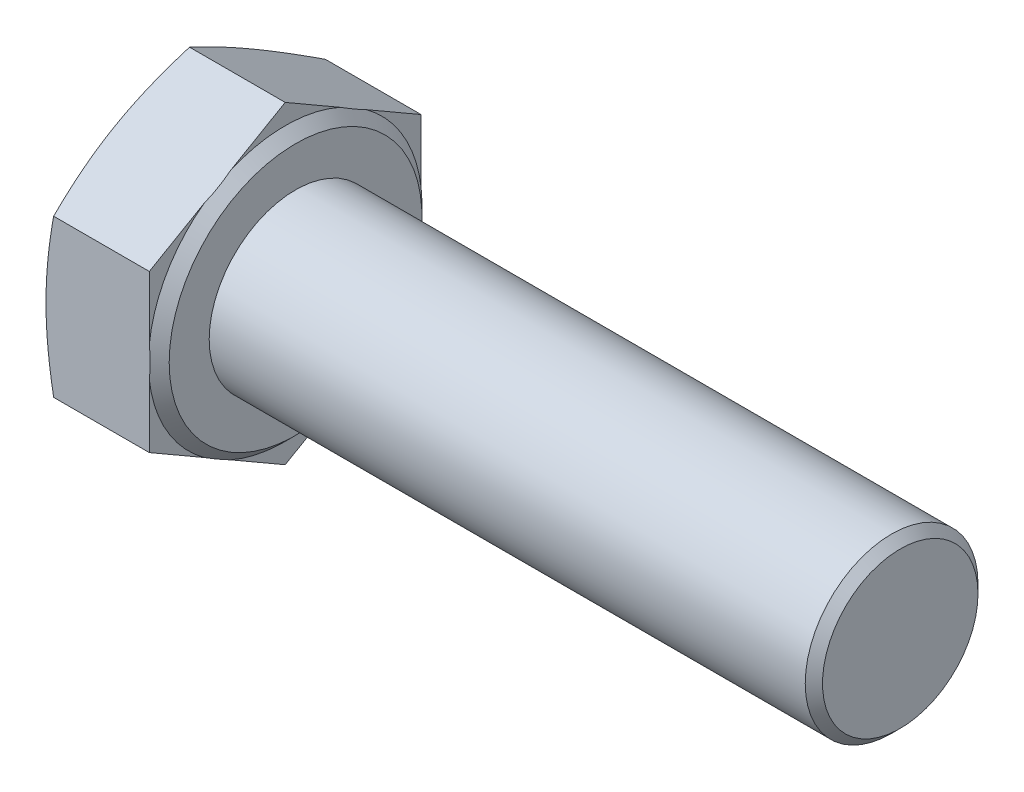
ISO-10303-21;
HEADER;
FILE_DESCRIPTION(('STEP AP214'),'2;1');
FILE_NAME('part.step','',(''),(''),'','','');
FILE_SCHEMA(('AUTOMOTIVE_DESIGN { 1 0 10303 214 1 1 1 1 }'));
ENDSEC;
DATA;
#1=APPLICATION_CONTEXT('core data for automotive mechanical design processes');
#2=APPLICATION_PROTOCOL_DEFINITION('international standard','automotive_design',2000,#1);
#3=PRODUCT_CONTEXT('',#1,'mechanical');
#4=PRODUCT('Part','Part','',(#3));
#5=PRODUCT_RELATED_PRODUCT_CATEGORY('part','',(#4));
#6=PRODUCT_DEFINITION_FORMATION('','',#4);
#7=PRODUCT_DEFINITION_CONTEXT('part definition',#1,'design');
#8=PRODUCT_DEFINITION('design','',#6,#7);
#9=PRODUCT_DEFINITION_SHAPE('','',#8);
#10=(LENGTH_UNIT() NAMED_UNIT(*) SI_UNIT(.MILLI.,.METRE.));
#11=(NAMED_UNIT(*) PLANE_ANGLE_UNIT() SI_UNIT($,.RADIAN.));
#12=(NAMED_UNIT(*) SI_UNIT($,.STERADIAN.) SOLID_ANGLE_UNIT());
#13=UNCERTAINTY_MEASURE_WITH_UNIT(LENGTH_MEASURE(1.E-05),#10,'distance_accuracy_value','');
#14=(GEOMETRIC_REPRESENTATION_CONTEXT(3) GLOBAL_UNCERTAINTY_ASSIGNED_CONTEXT((#13)) GLOBAL_UNIT_ASSIGNED_CONTEXT((#10,
#11,#12)) REPRESENTATION_CONTEXT('',''));
#15=CARTESIAN_POINT('',(0.,0.,0.));
#16=DIRECTION('',(0.,0.,1.));
#17=DIRECTION('',(1.,0.,0.));
#18=AXIS2_PLACEMENT_3D('',#15,#16,#17);
#19=CARTESIAN_POINT('',(6.58,-13.6225796015292,7.865));
#20=DIRECTION('',(-1.,0.,0.));
#21=DIRECTION('',(0.,0.,1.));
#22=AXIS2_PLACEMENT_3D('',#19,#20,#21);
#23=PLANE('',#22);
#24=CARTESIAN_POINT('',(6.58,0.,0.));
#25=DIRECTION('',(-1.,0.,0.));
#26=DIRECTION('',(0.,0.,1.));
#27=AXIS2_PLACEMENT_3D('',#24,#25,#26);
#28=CIRCLE('',#27,7.315);
#29=CARTESIAN_POINT('',(6.58,0.,7.315));
#30=VERTEX_POINT('',#29);
#31=EDGE_CURVE('E585',#30,#30,#28,.T.);
#32=ORIENTED_EDGE('',*,*,#31,.F.);
#33=EDGE_LOOP('',(#32));
#34=FACE_BOUND('',#33,.T.);
#35=CARTESIAN_POINT('',(6.58,0.,0.));
#36=DIRECTION('',(-1.,0.,0.));
#37=DIRECTION('',(0.,0.,1.));
#38=AXIS2_PLACEMENT_3D('',#35,#36,#37);
#39=CIRCLE('',#38,5.);
#40=CARTESIAN_POINT('',(6.58,0.,5.));
#41=VERTEX_POINT('',#40);
#42=EDGE_CURVE('E198',#41,#41,#39,.F.);
#43=ORIENTED_EDGE('',*,*,#42,.F.);
#44=EDGE_LOOP('',(#43));
#45=FACE_BOUND('',#44,.T.);
#46=ADVANCED_FACE('F50',(#34,#45),#23,.F.);
#47=CARTESIAN_POINT('',(6.58,-9.08171973435281,0.));
#48=DIRECTION('',(0.,0.866025403784439,0.5));
#49=DIRECTION('',(0.,-0.5,0.866025403784439));
#50=AXIS2_PLACEMENT_3D('',#47,#48,#49);
#51=PLANE('',#50);
#52=CARTESIAN_POINT('',(0.442891795212777,-4.54074439712257,-7.8652));
#53=CARTESIAN_POINT('',(0.374419710513131,-4.72880090562985,-7.53947657257138));
#54=CARTESIAN_POINT('',(0.31213253527496,-4.91747753754728,-7.21267905988943));
#55=CARTESIAN_POINT('',(0.202547931744523,-5.2960575790076,-6.55695919334861));
#56=CARTESIAN_POINT('',(0.155262232707484,-5.48596183060646,-6.22803538100606));
#57=CARTESIAN_POINT('',(0.0787789851506867,-5.86488964065851,-5.57171316159509));
#58=CARTESIAN_POINT('',(0.0494146172511895,-6.05390454554577,-5.24432974294255));
#59=CARTESIAN_POINT('',(0.0100287510814298,-6.43237636216652,-4.58879732732252));
#60=CARTESIAN_POINT('',(0.,-6.62183308146557,-4.26064866366126));
#61=CARTESIAN_POINT('',(0.,-7.00074652006365,-3.60435133633874));
#62=CARTESIAN_POINT('',(0.0100287510814299,-7.1902032393627,-3.27620267267748));
#63=CARTESIAN_POINT('',(0.0494146172511891,-7.56867505598345,-2.62067025705745));
#64=CARTESIAN_POINT('',(0.0787789851506858,-7.75768996087071,-2.29328683840491));
#65=CARTESIAN_POINT('',(0.155262232707484,-8.13661777092277,-1.63696461899394));
#66=CARTESIAN_POINT('',(0.202547931744523,-8.32652202252162,-1.30804080665138));
#67=CARTESIAN_POINT('',(0.31213253527496,-8.70510206398195,-0.652320940110567));
#68=CARTESIAN_POINT('',(0.374419710513132,-8.89377869589937,-0.325523427428618));
#69=CARTESIAN_POINT('',(0.442891795212777,-9.08183520440665,0.000200000000002632));
#70=B_SPLINE_CURVE_WITH_KNOTS('',3,(#52,#53,#54,#55,#56,#57,#58,#59,#60,#61,#62,#63,#64,#65,#66,
#67,#68,#69),.UNSPECIFIED.,.F.,.F.,(4,2,2,2,2,2,2,2,4),(0.,1.14700314621245,2.29490090600088,
3.43194374910872,4.56856000315232,5.70517625719591,6.84221910030376,7.99011686009219,
9.13712000630464),.UNSPECIFIED.);
#71=CARTESIAN_POINT('',(0.442849766748699,-4.54085986717642,-7.865));
#72=VERTEX_POINT('',#71);
#73=CARTESIAN_POINT('',(0.,-6.81128980076461,-3.9325));
#74=VERTEX_POINT('',#73);
#75=EDGE_CURVE('E162',#72,#74,#70,.T.);
#76=ORIENTED_EDGE('',*,*,#75,.F.);
#77=DIRECTION('',(-1.,0.,0.));
#78=VECTOR('',#77,1.);
#79=CARTESIAN_POINT('',(6.58,-4.54085986717641,-7.865));
#80=LINE('',#79,#78);
#81=CARTESIAN_POINT('',(5.98,-4.54085986717642,-7.865));
#82=VERTEX_POINT('',#81);
#83=EDGE_CURVE('E192',#82,#72,#80,.T.);
#84=ORIENTED_EDGE('',*,*,#83,.F.);
#85=DIRECTION('',(0.,0.5,-0.866025403784439));
#86=VECTOR('',#85,1.);
#87=CARTESIAN_POINT('',(5.98,-9.08171973435281,0.));
#88=LINE('',#87,#86);
#89=CARTESIAN_POINT('',(5.98,-6.36716144094054,-4.70175288429752));
#90=VERTEX_POINT('',#89);
#91=EDGE_CURVE('E335',#90,#82,#88,.T.);
#92=ORIENTED_EDGE('',*,*,#91,.F.);
#93=CARTESIAN_POINT('',(5.9798,-7.2563083509398,-3.16170526078593));
#94=CARTESIAN_POINT('',(5.99646670915282,-7.18233435080144,-3.28983198746467));
#95=CARTESIAN_POINT('',(6.00903010165886,-7.1081250284613,-3.41836630415306));
#96=CARTESIAN_POINT('',(6.02578356494241,-6.95970657625887,-3.6754346041484));
#97=CARTESIAN_POINT('',(6.03000000000001,-6.88549818851174,-3.8039673020742));
#98=CARTESIAN_POINT('',(6.03000000000001,-6.73708141301749,-4.06103269792578));
#99=CARTESIAN_POINT('',(6.02578356494241,-6.66287302527037,-4.18956539585158));
#100=CARTESIAN_POINT('',(6.00903010165886,-6.51445457306793,-4.44663369584692));
#101=CARTESIAN_POINT('',(5.99646670915282,-6.44024525072779,-4.57516801253531));
#102=CARTESIAN_POINT('',(5.9798,-6.36627125058943,-4.70329473921405));
#103=B_SPLINE_CURVE_WITH_KNOTS('',3,(#93,#94,#95,#96,#97,#98,#99,#100,#101,#102),.UNSPECIFIED.,
.F.,.F.,(4,2,2,2,4),(0.,0.446607529504018,0.891802161815945,1.33699679412787,1.78360432363189),.UNSPECIFIED.);
#104=CARTESIAN_POINT('',(5.98,-7.25541816058868,-3.16324711570247));
#105=VERTEX_POINT('',#104);
#106=EDGE_CURVE('E320',#105,#90,#103,.T.);
#107=ORIENTED_EDGE('',*,*,#106,.F.);
#108=CARTESIAN_POINT('',(5.98,-9.08171973435282,0.));
#109=VERTEX_POINT('',#108);
#110=EDGE_CURVE('E326',#109,#105,#88,.T.);
#111=ORIENTED_EDGE('',*,*,#110,.F.);
#112=DIRECTION('',(-1.,0.,0.));
#113=VECTOR('',#112,1.);
#114=CARTESIAN_POINT('',(6.58,-9.08171973435281,0.));
#115=LINE('',#114,#113);
#116=CARTESIAN_POINT('',(0.442849766748699,-9.08171973435282,0.));
#117=VERTEX_POINT('',#116);
#118=EDGE_CURVE('E184',#109,#117,#115,.T.);
#119=ORIENTED_EDGE('',*,*,#118,.T.);
#120=EDGE_CURVE('E276',#74,#117,#70,.T.);
#121=ORIENTED_EDGE('',*,*,#120,.F.);
#122=EDGE_LOOP('',(#76,#84,#92,#107,#111,#119,#121));
#123=FACE_BOUND('',#122,.T.);
#124=ADVANCED_FACE('F217',(#123),#51,.F.);
#125=CARTESIAN_POINT('',(6.58,-4.54085986717641,-7.865));
#126=DIRECTION('',(0.,0.,1.));
#127=DIRECTION('',(1.,0.,0.));
#128=AXIS2_PLACEMENT_3D('',#125,#126,#127);
#129=PLANE('',#128);
#130=CARTESIAN_POINT('',(2.36641352883534,-12.0226002521994,-7.865));
#131=CARTESIAN_POINT('',(2.2580600665346,-11.6667592108969,-7.865));
#132=CARTESIAN_POINT('',(2.15097094806915,-11.3105260197279,-7.865));
#133=CARTESIAN_POINT('',(1.94002083195681,-10.5970756919498,-7.865));
#134=CARTESIAN_POINT('',(1.83616008975262,-10.2398584799029,-7.865));
#135=CARTESIAN_POINT('',(1.63219338793846,-9.52362904909049,-7.865));
#136=CARTESIAN_POINT('',(1.53209479535907,-9.16461472477212,-7.865));
#137=CARTESIAN_POINT('',(1.33682427451146,-8.44525058341012,-7.865));
#138=CARTESIAN_POINT('',(1.24165225778545,-8.08490079046971,-7.865));
#139=CARTESIAN_POINT('',(1.0585905385423,-7.36707846156647,-7.865));
#140=CARTESIAN_POINT('',(0.970625516530099,-7.00962522951279,-7.865));
#141=CARTESIAN_POINT('',(0.802184639608979,-6.29294003205345,-7.865));
#142=CARTESIAN_POINT('',(0.721708910733727,-5.93370803682097,-7.865));
#143=CARTESIAN_POINT('',(0.570122836565262,-5.21338493122039,-7.865));
#144=CARTESIAN_POINT('',(0.499009296610735,-4.85229449893847,-7.865));
#145=CARTESIAN_POINT('',(0.368312985121942,-4.12801725415188,-7.865));
#146=CARTESIAN_POINT('',(0.308729827253168,-3.76483051230575,-7.865));
#147=CARTESIAN_POINT('',(0.209414441038813,-3.07725690165157,-7.865));
#148=CARTESIAN_POINT('',(0.168205546214481,-2.7530853328262,-7.865));
#149=CARTESIAN_POINT('',(0.0984487044914573,-2.10337143697526,-7.865));
#150=CARTESIAN_POINT('',(0.0699003886504236,-1.77782915017295,-7.865));
#151=CARTESIAN_POINT('',(0.0268395333928627,-1.1260341381528,-7.865));
#152=CARTESIAN_POINT('',(0.0123170662625512,-0.799782079500944,-7.865));
#153=CARTESIAN_POINT('',(-0.00195682196202637,-0.146951554097976,-7.865));
#154=CARTESIAN_POINT('',(-0.00170834736825149,0.17962691033178,-7.865));
#155=CARTESIAN_POINT('',(0.013584830590724,0.83408860580392,-7.865));
#156=CARTESIAN_POINT('',(0.0287045666873488,1.1619700543289,-7.865));
#157=CARTESIAN_POINT('',(0.0730444535855848,1.81676988175852,-7.865));
#158=CARTESIAN_POINT('',(0.10226494314847,2.14368823733564,-7.865));
#159=CARTESIAN_POINT('',(0.173439416526266,2.79640045175946,-7.865));
#160=CARTESIAN_POINT('',(0.215404337365143,3.12219310070865,-7.865));
#161=CARTESIAN_POINT('',(0.310365462203544,3.77214853671124,-7.865));
#162=CARTESIAN_POINT('',(0.363361725327741,4.09631131501949,-7.865));
#163=CARTESIAN_POINT('',(0.48171036604926,4.76006524207304,-7.865));
#164=CARTESIAN_POINT('',(0.54756804831913,5.09956549095025,-7.865));
#165=CARTESIAN_POINT('',(0.68775969136854,5.77682257574967,-7.865));
#166=CARTESIAN_POINT('',(0.762094291182787,6.11457927822532,-7.865));
#167=CARTESIAN_POINT('',(0.917678889211968,6.78858995476071,-7.865));
#168=CARTESIAN_POINT('',(0.998930895809679,7.12484346235698,-7.865));
#169=CARTESIAN_POINT('',(1.16702859371564,7.79593398735149,-7.865));
#170=CARTESIAN_POINT('',(1.25387415094818,8.1307710384969,-7.865));
#171=CARTESIAN_POINT('',(1.43222777068835,8.79965725830403,-7.865));
#172=CARTESIAN_POINT('',(1.52374167778338,9.13370486288185,-7.865));
#173=CARTESIAN_POINT('',(1.71049239515709,9.80075635699057,-7.865));
#174=CARTESIAN_POINT('',(1.80572922122974,10.1337602420872,-7.865));
#175=CARTESIAN_POINT('',(1.99924297662574,10.7988194802628,-7.865));
#176=CARTESIAN_POINT('',(2.09751937989521,11.1308749867297,-7.865));
#177=CARTESIAN_POINT('',(2.29660417636339,11.7942269637766,-7.865));
#178=CARTESIAN_POINT('',(2.39741258611677,12.1255234293784,-7.865));
#179=CARTESIAN_POINT('',(2.70073124187539,13.1111316113962,-7.865));
#180=CARTESIAN_POINT('',(2.90629348400979,13.7645038967645,-7.865));
#181=CARTESIAN_POINT('',(3.32324319611831,15.0694121850919,-7.865));
#182=CARTESIAN_POINT('',(3.53463094557802,15.7209480982901,-7.865));
#183=CARTESIAN_POINT('',(3.96086805240708,17.0201471473339,-7.865));
#184=CARTESIAN_POINT('',(4.17570123192526,17.6678155976447,-7.865));
#185=CARTESIAN_POINT('',(4.50033413441196,18.6384901456375,-7.865));
#186=CARTESIAN_POINT('',(4.60893786794372,18.9618972960534,-7.865));
#187=CARTESIAN_POINT('',(4.82684807618741,19.6084739186475,-7.865));
#188=CARTESIAN_POINT('',(4.93615454918639,19.9316433914029,-7.865));
#189=CARTESIAN_POINT('',(5.04576544996388,20.2547096296475,-7.865));
#190=B_SPLINE_CURVE_WITH_KNOTS('',3,(#130,#131,#132,#133,#134,#135,#136,#137,#138,#139,#140,
#141,#142,#143,#144,#145,#146,#147,#148,#149,#150,#151,#152,#153,#154,#155,#156,#157,#158,#159,
#160,#161,#162,#163,#164,#165,#166,#167,#168,#169,#170,#171,#172,#173,#174,#175,#176,#177,#178,
#179,#180,#181,#182,#183,#184,#185,#186,#187,#188,#189),.UNSPECIFIED.,.F.,.F.,(4,2,2,2,2,2,2,2,
2,2,2,2,2,2,2,2,2,2,2,2,2,2,2,2,2,2,2,2,2,4),(0.,1.11592451335134,2.23193709973416,
3.35003188749545,4.46810659263983,5.57239601256039,6.67670401267008,7.78063420744246,
8.88452740776003,9.86465314915734,10.8447503268016,11.8241532668998,12.8035492904839,
13.7879123241796,14.7722990077235,15.7575328715573,16.7427720160839,17.78012614953,
18.8175585359564,19.8552931619037,20.8930029229185,21.932045362512,22.971092210578,
24.0099602280774,25.0488350396308,27.1036289647327,29.1585216432028,31.2056173678942,
32.2290827778725,33.2525456940577),.UNSPECIFIED.);
#191=CARTESIAN_POINT('',(0.442849766748699,4.54085986717641,-7.865));
#192=VERTEX_POINT('',#191);
#193=CARTESIAN_POINT('',(0.,0.,-7.865));
#194=VERTEX_POINT('',#193);
#195=EDGE_CURVE('E295',#192,#194,#190,.F.);
#196=ORIENTED_EDGE('',*,*,#195,.F.);
#197=DIRECTION('',(-1.,0.,0.));
#198=VECTOR('',#197,1.);
#199=CARTESIAN_POINT('',(6.58,4.54085986717641,-7.865));
#200=LINE('',#199,#198);
#201=CARTESIAN_POINT('',(5.98,4.54085986717641,-7.865));
#202=VERTEX_POINT('',#201);
#203=EDGE_CURVE('E185',#202,#192,#200,.T.);
#204=ORIENTED_EDGE('',*,*,#203,.F.);
#205=DIRECTION('',(0.,1.,0.));
#206=VECTOR('',#205,1.);
#207=CARTESIAN_POINT('',(5.98,-4.54085986717641,-7.865));
#208=LINE('',#207,#206);
#209=CARTESIAN_POINT('',(5.98,0.888256719648157,-7.865));
#210=VERTEX_POINT('',#209);
#211=EDGE_CURVE('E338',#210,#202,#208,.T.);
#212=ORIENTED_EDGE('',*,*,#211,.F.);
#213=CARTESIAN_POINT('',(4.95281448287955,-4.25493323362414,-7.865));
#214=CARTESIAN_POINT('',(5.07224674422361,-4.00381767979159,-7.865));
#215=CARTESIAN_POINT('',(5.1852007071726,-3.74935435711382,-7.865));
#216=CARTESIAN_POINT('',(5.39477690609979,-3.23290692572169,-7.865));
#217=CARTESIAN_POINT('',(5.49134731670986,-2.97090190905984,-7.865));
#218=CARTESIAN_POINT('',(5.66341320093298,-2.44188823017792,-7.865));
#219=CARTESIAN_POINT('',(5.7390458683139,-2.17492499451166,-7.865));
#220=CARTESIAN_POINT('',(5.86601117735481,-1.6355184072639,-7.865));
#221=CARTESIAN_POINT('',(5.91737529329116,-1.36308263409081,-7.865));
#222=CARTESIAN_POINT('',(5.98170365844323,-0.894044676460957,-7.865));
#223=CARTESIAN_POINT('',(6.0014844739477,-0.698365723329962,-7.865));
#224=CARTESIAN_POINT('',(6.02648132847238,-0.306035610110695,-7.865));
#225=CARTESIAN_POINT('',(6.03169564403578,-0.109384337738236,-7.865));
#226=CARTESIAN_POINT('',(6.02733646784886,0.283885883127008,-7.865));
#227=CARTESIAN_POINT('',(6.01775297726552,0.480504719906107,-7.865));
#228=CARTESIAN_POINT('',(5.98416907487251,0.87245694944574,-7.865));
#229=CARTESIAN_POINT('',(5.96017040747733,1.06779049485143,-7.865));
#230=CARTESIAN_POINT('',(5.88319291404413,1.55355431244838,-7.865));
#231=CARTESIAN_POINT('',(5.82172156211773,1.84265691326911,-7.865));
#232=CARTESIAN_POINT('',(5.67244236510524,2.41426382178008,-7.865));
#233=CARTESIAN_POINT('',(5.58459433393685,2.69675734726316,-7.865));
#234=CARTESIAN_POINT('',(5.38697042620144,3.25528983169129,-7.865));
#235=CARTESIAN_POINT('',(5.27709906873763,3.53129462565732,-7.865));
#236=CARTESIAN_POINT('',(5.09956194454999,3.93908690549662,-7.865));
#237=CARTESIAN_POINT('',(5.03837569368458,4.07375872223425,-7.865));
#238=CARTESIAN_POINT('',(4.91219062578649,4.34125726474726,-7.865));
#239=CARTESIAN_POINT('',(4.8471929563225,4.47408453114661,-7.865));
#240=CARTESIAN_POINT('',(4.78050524465145,4.60606010005044,-7.865));
#241=B_SPLINE_CURVE_WITH_KNOTS('',3,(#213,#214,#215,#216,#217,#218,#219,#220,#221,#222,#223,
#224,#225,#226,#227,#228,#229,#230,#231,#232,#233,#234,#235,#236,#237,#238,#239,#240),
.UNSPECIFIED.,.F.,.F.,(4,2,2,2,2,2,2,2,2,2,2,2,2,4),(0.,0.834481732062272,1.67155582149863,
2.50300768684546,3.33337824868057,3.92290979018692,4.51251108002938,5.10251093605802,
5.69243940919473,6.57758291183943,7.46408187376857,8.35451073181988,8.79822291544169,
9.24180218228585),.UNSPECIFIED.);
#242=CARTESIAN_POINT('',(5.98,-0.888256719648157,-7.865));
#243=VERTEX_POINT('',#242);
#244=EDGE_CURVE('E309',#243,#210,#241,.T.);
#245=ORIENTED_EDGE('',*,*,#244,.F.);
#246=EDGE_CURVE('E342',#82,#243,#208,.T.);
#247=ORIENTED_EDGE('',*,*,#246,.F.);
#248=ORIENTED_EDGE('',*,*,#83,.T.);
#249=EDGE_CURVE('E173',#194,#72,#190,.F.);
#250=ORIENTED_EDGE('',*,*,#249,.F.);
#251=EDGE_LOOP('',(#196,#204,#212,#245,#247,#248,#250));
#252=FACE_BOUND('',#251,.T.);
#253=ADVANCED_FACE('F223',(#252),#129,.F.);
#254=CARTESIAN_POINT('',(6.58,4.54085986717641,-7.865));
#255=DIRECTION('',(0.,-0.866025403784439,0.5));
#256=DIRECTION('',(0.,-0.5,-0.866025403784439));
#257=AXIS2_PLACEMENT_3D('',#254,#255,#256);
#258=PLANE('',#257);
#259=CARTESIAN_POINT('',(0.442891795212779,9.08183520440666,0.000199999999999353));
#260=CARTESIAN_POINT('',(0.374419710513133,8.89377869589937,-0.325523427428621));
#261=CARTESIAN_POINT('',(0.312132535274961,8.70510206398195,-0.652320940110569));
#262=CARTESIAN_POINT('',(0.202547931744525,8.32652202252163,-1.30804080665139));
#263=CARTESIAN_POINT('',(0.155262232707486,8.13661777092277,-1.63696461899394));
#264=CARTESIAN_POINT('',(0.0787789851506878,7.75768996087072,-2.29328683840491));
#265=CARTESIAN_POINT('',(0.0494146172511909,7.56867505598346,-2.62067025705745));
#266=CARTESIAN_POINT('',(0.0100287510814313,7.1902032393627,-3.27620267267748));
#267=CARTESIAN_POINT('',(0.,7.00074652006366,-3.60435133633874));
#268=CARTESIAN_POINT('',(0.,6.62183308146557,-4.26064866366126));
#269=CARTESIAN_POINT('',(0.010028751081431,6.43237636216653,-4.58879732732252));
#270=CARTESIAN_POINT('',(0.0494146172511904,6.05390454554578,-5.24432974294255));
#271=CARTESIAN_POINT('',(0.0787789851506873,5.86488964065851,-5.57171316159509));
#272=CARTESIAN_POINT('',(0.155262232707485,5.48596183060646,-6.22803538100605));
#273=CARTESIAN_POINT('',(0.202547931744524,5.29605757900761,-6.55695919334861));
#274=CARTESIAN_POINT('',(0.31213253527496,4.91747753754728,-7.21267905988943));
#275=CARTESIAN_POINT('',(0.374419710513132,4.72880090562986,-7.53947657257138));
#276=CARTESIAN_POINT('',(0.442891795212777,4.54074439712258,-7.8652));
#277=B_SPLINE_CURVE_WITH_KNOTS('',3,(#259,#260,#261,#262,#263,#264,#265,#266,#267,#268,#269,
#270,#271,#272,#273,#274,#275,#276),.UNSPECIFIED.,.F.,.F.,(4,2,2,2,2,2,2,2,4),(0.,
1.14700314621245,2.29490090600088,3.43194374910872,4.56856000315232,5.70517625719591,
6.84221910030375,7.99011686009218,9.13712000630463),.UNSPECIFIED.);
#278=CARTESIAN_POINT('',(0.442849766748699,9.08171973435282,0.));
#279=VERTEX_POINT('',#278);
#280=CARTESIAN_POINT('',(0.,6.81128980076461,-3.9325));
#281=VERTEX_POINT('',#280);
#282=EDGE_CURVE('E580',#279,#281,#277,.T.);
#283=ORIENTED_EDGE('',*,*,#282,.F.);
#284=DIRECTION('',(-1.,0.,0.));
#285=VECTOR('',#284,1.);
#286=CARTESIAN_POINT('',(6.58,9.08171973435282,0.));
#287=LINE('',#286,#285);
#288=CARTESIAN_POINT('',(5.98,9.08171973435282,0.));
#289=VERTEX_POINT('',#288);
#290=EDGE_CURVE('E177',#289,#279,#287,.T.);
#291=ORIENTED_EDGE('',*,*,#290,.F.);
#292=DIRECTION('',(0.,0.5,0.866025403784439));
#293=VECTOR('',#292,1.);
#294=CARTESIAN_POINT('',(5.98,4.54085986717641,-7.865));
#295=LINE('',#294,#293);
#296=CARTESIAN_POINT('',(5.98,7.25541816058867,-3.16324711570251));
#297=VERTEX_POINT('',#296);
#298=EDGE_CURVE('E340',#297,#289,#295,.T.);
#299=ORIENTED_EDGE('',*,*,#298,.F.);
#300=CARTESIAN_POINT('',(5.9798,6.36627125058945,-4.70329473921403));
#301=CARTESIAN_POINT('',(5.99646670915282,6.4402452507278,-4.57516801253529));
#302=CARTESIAN_POINT('',(6.00903010165886,6.51445457306795,-4.44663369584691));
#303=CARTESIAN_POINT('',(6.0257835649424,6.66287302527037,-4.18956539585158));
#304=CARTESIAN_POINT('',(6.03,6.73708141301749,-4.06103269792579));
#305=CARTESIAN_POINT('',(6.03,6.88549818851174,-3.80396730207422));
#306=CARTESIAN_POINT('',(6.0257835649424,6.95970657625886,-3.67543460414843));
#307=CARTESIAN_POINT('',(6.00903010165886,7.10812502846128,-3.4183663041531));
#308=CARTESIAN_POINT('',(5.99646670915282,7.18233435080142,-3.28983198746472));
#309=CARTESIAN_POINT('',(5.9798,7.25630835093978,-3.16170526078598));
#310=B_SPLINE_CURVE_WITH_KNOTS('',3,(#300,#301,#302,#303,#304,#305,#306,#307,#308,#309),
.UNSPECIFIED.,.F.,.F.,(4,2,2,2,4),(0.,0.446607529503998,0.891802161815904,1.33699679412781,
1.78360432363181),.UNSPECIFIED.);
#311=CARTESIAN_POINT('',(5.98,6.36716144094056,-4.7017528842975));
#312=VERTEX_POINT('',#311);
#313=EDGE_CURVE('E319',#312,#297,#310,.T.);
#314=ORIENTED_EDGE('',*,*,#313,.F.);
#315=EDGE_CURVE('E339',#202,#312,#295,.T.);
#316=ORIENTED_EDGE('',*,*,#315,.F.);
#317=ORIENTED_EDGE('',*,*,#203,.T.);
#318=EDGE_CURVE('E294',#281,#192,#277,.T.);
#319=ORIENTED_EDGE('',*,*,#318,.F.);
#320=EDGE_LOOP('',(#283,#291,#299,#314,#316,#317,#319));
#321=FACE_BOUND('',#320,.T.);
#322=ADVANCED_FACE('F302',(#321),#258,.F.);
#323=CARTESIAN_POINT('',(6.58,9.08171973435282,0.));
#324=DIRECTION('',(0.,-0.866025403784439,-0.5));
#325=DIRECTION('',(0.,0.5,-0.866025403784439));
#326=AXIS2_PLACEMENT_3D('',#323,#324,#325);
#327=PLANE('',#326);
#328=CARTESIAN_POINT('',(0.442891795212779,4.54074439712257,7.8652));
#329=CARTESIAN_POINT('',(0.374419710513134,4.72880090562986,7.53947657257138));
#330=CARTESIAN_POINT('',(0.312132535274962,4.91747753754728,7.21267905988944));
#331=CARTESIAN_POINT('',(0.202547931744525,5.29605757900761,6.55695919334862));
#332=CARTESIAN_POINT('',(0.155262232707486,5.48596183060646,6.22803538100606));
#333=CARTESIAN_POINT('',(0.0787789851506885,5.86488964065851,5.57171316159509));
#334=CARTESIAN_POINT('',(0.0494146172511912,6.05390454554577,5.24432974294256));
#335=CARTESIAN_POINT('',(0.0100287510814316,6.43237636216653,4.58879732732252));
#336=CARTESIAN_POINT('',(0.,6.62183308146557,4.26064866366126));
#337=CARTESIAN_POINT('',(0.,7.00074652006366,3.60435133633874));
#338=CARTESIAN_POINT('',(0.0100287510814315,7.1902032393627,3.27620267267749));
#339=CARTESIAN_POINT('',(0.0494146172511911,7.56867505598346,2.62067025705745));
#340=CARTESIAN_POINT('',(0.0787789851506883,7.75768996087072,2.29328683840491));
#341=CARTESIAN_POINT('',(0.155262232707486,8.13661777092277,1.63696461899395));
#342=CARTESIAN_POINT('',(0.202547931744525,8.32652202252163,1.30804080665139));
#343=CARTESIAN_POINT('',(0.312132535274961,8.70510206398195,0.652320940110571));
#344=CARTESIAN_POINT('',(0.374419710513133,8.89377869589937,0.325523427428622));
#345=CARTESIAN_POINT('',(0.442891795212779,9.08183520440666,-0.000199999999998583));
#346=B_SPLINE_CURVE_WITH_KNOTS('',3,(#328,#329,#330,#331,#332,#333,#334,#335,#336,#337,#338,
#339,#340,#341,#342,#343,#344,#345),.UNSPECIFIED.,.F.,.F.,(4,2,2,2,2,2,2,2,4),(0.,
1.14700314621245,2.29490090600088,3.43194374910873,4.56856000315232,5.70517625719591,
6.84221910030376,7.99011686009219,9.13712000630464),.UNSPECIFIED.);
#347=CARTESIAN_POINT('',(0.442849766748699,4.54085986717641,7.865));
#348=VERTEX_POINT('',#347);
#349=CARTESIAN_POINT('',(0.,6.81128980076461,3.9325));
#350=VERTEX_POINT('',#349);
#351=EDGE_CURVE('E160',#348,#350,#346,.T.);
#352=ORIENTED_EDGE('',*,*,#351,.F.);
#353=DIRECTION('',(-1.,0.,0.));
#354=VECTOR('',#353,1.);
#355=CARTESIAN_POINT('',(6.58,4.54085986717641,7.865));
#356=LINE('',#355,#354);
#357=CARTESIAN_POINT('',(5.98,4.54085986717641,7.865));
#358=VERTEX_POINT('',#357);
#359=EDGE_CURVE('E167',#358,#348,#356,.T.);
#360=ORIENTED_EDGE('',*,*,#359,.F.);
#361=DIRECTION('',(0.,-0.5,0.866025403784439));
#362=VECTOR('',#361,1.);
#363=CARTESIAN_POINT('',(5.98,9.08171973435282,0.));
#364=LINE('',#363,#362);
#365=CARTESIAN_POINT('',(5.98,6.36716144094056,4.7017528842975));
#366=VERTEX_POINT('',#365);
#367=EDGE_CURVE('E332',#366,#358,#364,.T.);
#368=ORIENTED_EDGE('',*,*,#367,.F.);
#369=CARTESIAN_POINT('',(5.9798,7.25630835093977,3.16170526078599));
#370=CARTESIAN_POINT('',(5.99646670915282,7.18233435080141,3.28983198746474));
#371=CARTESIAN_POINT('',(6.00903010165886,7.10812502846126,3.41836630415314));
#372=CARTESIAN_POINT('',(6.02578356494241,6.95970657625882,3.6754346041485));
#373=CARTESIAN_POINT('',(6.03,6.88549818851169,3.80396730207431));
#374=CARTESIAN_POINT('',(6.03,6.73708141301742,4.06103269792591));
#375=CARTESIAN_POINT('',(6.02578356494239,6.66287302527029,4.18956539585171));
#376=CARTESIAN_POINT('',(6.00903010165884,6.51445457306785,4.44663369584708));
#377=CARTESIAN_POINT('',(5.9964667091528,6.4402452507277,4.57516801253547));
#378=CARTESIAN_POINT('',(5.97979999999997,6.36627125058934,4.70329473921423));
#379=B_SPLINE_CURVE_WITH_KNOTS('',3,(#369,#370,#371,#372,#373,#374,#375,#376,#377,#378),
.UNSPECIFIED.,.F.,.F.,(4,2,2,2,4),(0.,0.446607529504053,0.891802161816013,1.33699679412797,
1.78360432363203),.UNSPECIFIED.);
#380=CARTESIAN_POINT('',(5.98,7.25541816058867,3.16324711570251));
#381=VERTEX_POINT('',#380);
#382=EDGE_CURVE('E374',#381,#366,#379,.T.);
#383=ORIENTED_EDGE('',*,*,#382,.F.);
#384=EDGE_CURVE('E337',#289,#381,#364,.T.);
#385=ORIENTED_EDGE('',*,*,#384,.F.);
#386=ORIENTED_EDGE('',*,*,#290,.T.);
#387=EDGE_CURVE('E175',#350,#279,#346,.T.);
#388=ORIENTED_EDGE('',*,*,#387,.F.);
#389=EDGE_LOOP('',(#352,#360,#368,#383,#385,#386,#388));
#390=FACE_BOUND('',#389,.T.);
#391=ADVANCED_FACE('F166',(#390),#327,.F.);
#392=CARTESIAN_POINT('',(6.58,4.54085986717641,7.865));
#393=DIRECTION('',(0.,0.,-1.));
#394=DIRECTION('',(-1.,0.,0.));
#395=AXIS2_PLACEMENT_3D('',#392,#393,#394);
#396=PLANE('',#395);
#397=CARTESIAN_POINT('',(2.36641352883534,-12.0226002521994,7.865));
#398=CARTESIAN_POINT('',(2.2580600665346,-11.6667592108969,7.865));
#399=CARTESIAN_POINT('',(2.15097094806915,-11.3105260197279,7.865));
#400=CARTESIAN_POINT('',(1.94002083195681,-10.5970756919498,7.865));
#401=CARTESIAN_POINT('',(1.83616008975262,-10.2398584799029,7.865));
#402=CARTESIAN_POINT('',(1.63219338793846,-9.52362904909048,7.865));
#403=CARTESIAN_POINT('',(1.53209479535907,-9.16461472477211,7.865));
#404=CARTESIAN_POINT('',(1.33682427451146,-8.44525058341011,7.865));
#405=CARTESIAN_POINT('',(1.24165225778545,-8.0849007904697,7.865));
#406=CARTESIAN_POINT('',(1.0585905385423,-7.36707846156647,7.865));
#407=CARTESIAN_POINT('',(0.970625516530099,-7.00962522951278,7.865));
#408=CARTESIAN_POINT('',(0.802184639608978,-6.29294003205345,7.865));
#409=CARTESIAN_POINT('',(0.721708910733726,-5.93370803682097,7.865));
#410=CARTESIAN_POINT('',(0.570122836565261,-5.21338493122038,7.865));
#411=CARTESIAN_POINT('',(0.499009296610735,-4.85229449893847,7.865));
#412=CARTESIAN_POINT('',(0.368312985121942,-4.12801725415188,7.865));
#413=CARTESIAN_POINT('',(0.308729827253168,-3.76483051230574,7.865));
#414=CARTESIAN_POINT('',(0.209414441038814,-3.07725690165156,7.865));
#415=CARTESIAN_POINT('',(0.168205546214482,-2.75308533282619,7.865));
#416=CARTESIAN_POINT('',(0.0984487044914585,-2.10337143697526,7.865));
#417=CARTESIAN_POINT('',(0.0699003886504243,-1.77782915017295,7.865));
#418=CARTESIAN_POINT('',(0.0268395333928633,-1.1260341381528,7.865));
#419=CARTESIAN_POINT('',(0.0123170662625523,-0.799782079500942,7.865));
#420=CARTESIAN_POINT('',(-0.00195682196202495,-0.146951554097974,7.865));
#421=CARTESIAN_POINT('',(-0.00170834736825019,0.179626910331781,7.865));
#422=CARTESIAN_POINT('',(0.0135848305907252,0.834088605803922,7.865));
#423=CARTESIAN_POINT('',(0.02870456668735,1.1619700543289,7.865));
#424=CARTESIAN_POINT('',(0.0730444535855861,1.81676988175852,7.865));
#425=CARTESIAN_POINT('',(0.102264943148471,2.14368823733564,7.865));
#426=CARTESIAN_POINT('',(0.173439416526267,2.79640045175946,7.865));
#427=CARTESIAN_POINT('',(0.215404337365144,3.12219310070865,7.865));
#428=CARTESIAN_POINT('',(0.310365462203545,3.77214853671124,7.865));
#429=CARTESIAN_POINT('',(0.363361725327742,4.09631131501949,7.865));
#430=CARTESIAN_POINT('',(0.481710366049261,4.76006524207304,7.865));
#431=CARTESIAN_POINT('',(0.547568048319132,5.09956549095025,7.865));
#432=CARTESIAN_POINT('',(0.687759691368541,5.77682257574967,7.865));
#433=CARTESIAN_POINT('',(0.762094291182789,6.11457927822533,7.865));
#434=CARTESIAN_POINT('',(0.91767888921197,6.78858995476071,7.865));
#435=CARTESIAN_POINT('',(0.998930895809681,7.12484346235698,7.865));
#436=CARTESIAN_POINT('',(1.16702859371564,7.79593398735149,7.865));
#437=CARTESIAN_POINT('',(1.25387415094818,8.1307710384969,7.865));
#438=CARTESIAN_POINT('',(1.43222777068835,8.79965725830403,7.865));
#439=CARTESIAN_POINT('',(1.52374167778338,9.13370486288186,7.865));
#440=CARTESIAN_POINT('',(1.71049239515709,9.80075635699058,7.865));
#441=CARTESIAN_POINT('',(1.80572922122974,10.1337602420872,7.865));
#442=CARTESIAN_POINT('',(1.99924297662574,10.7988194802628,7.865));
#443=CARTESIAN_POINT('',(2.09751937989521,11.1308749867298,7.865));
#444=CARTESIAN_POINT('',(2.29660417636339,11.7942269637766,7.865));
#445=CARTESIAN_POINT('',(2.39741258611677,12.1255234293784,7.865));
#446=CARTESIAN_POINT('',(2.70073124187539,13.1111316113962,7.865));
#447=CARTESIAN_POINT('',(2.90629348400979,13.7645038967645,7.865));
#448=CARTESIAN_POINT('',(3.32324319611831,15.0694121850919,7.865));
#449=CARTESIAN_POINT('',(3.53463094557802,15.7209480982901,7.865));
#450=CARTESIAN_POINT('',(3.96086805240708,17.0201471473339,7.865));
#451=CARTESIAN_POINT('',(4.17570123192526,17.6678155976447,7.865));
#452=CARTESIAN_POINT('',(4.50033413441196,18.6384901456375,7.865));
#453=CARTESIAN_POINT('',(4.60893786794372,18.9618972960534,7.865));
#454=CARTESIAN_POINT('',(4.82684807618741,19.6084739186475,7.865));
#455=CARTESIAN_POINT('',(4.93615454918639,19.9316433914029,7.865));
#456=CARTESIAN_POINT('',(5.04576544996388,20.2547096296475,7.865));
#457=B_SPLINE_CURVE_WITH_KNOTS('',3,(#397,#398,#399,#400,#401,#402,#403,#404,#405,#406,#407,
#408,#409,#410,#411,#412,#413,#414,#415,#416,#417,#418,#419,#420,#421,#422,#423,#424,#425,#426,
#427,#428,#429,#430,#431,#432,#433,#434,#435,#436,#437,#438,#439,#440,#441,#442,#443,#444,#445,
#446,#447,#448,#449,#450,#451,#452,#453,#454,#455,#456),.UNSPECIFIED.,.F.,.F.,(4,2,2,2,2,2,2,2,
2,2,2,2,2,2,2,2,2,2,2,2,2,2,2,2,2,2,2,2,2,4),(0.,1.11592451335134,2.23193709973417,
3.35003188749546,4.46810659263983,5.57239601256039,6.67670401267008,7.78063420744246,
8.88452740776003,9.86465314915734,10.8447503268016,11.8241532668998,12.8035492904839,
13.7879123241796,14.7722990077235,15.7575328715573,16.7427720160839,17.78012614953,
18.8175585359564,19.8552931619037,20.8930029229185,21.932045362512,22.971092210578,
24.0099602280774,25.0488350396308,27.1036289647327,29.1585216432028,31.2056173678942,
32.2290827778725,33.2525456940577),.UNSPECIFIED.);
#458=CARTESIAN_POINT('',(0.442849766748699,-4.5408598671764,7.86500000000001));
#459=VERTEX_POINT('',#458);
#460=CARTESIAN_POINT('',(0.,0.,7.865));
#461=VERTEX_POINT('',#460);
#462=EDGE_CURVE('E165',#459,#461,#457,.T.);
#463=ORIENTED_EDGE('',*,*,#462,.F.);
#464=DIRECTION('',(-1.,0.,0.));
#465=VECTOR('',#464,1.);
#466=CARTESIAN_POINT('',(6.58,-4.5408598671764,7.865));
#467=LINE('',#466,#465);
#468=CARTESIAN_POINT('',(5.98,-4.5408598671764,7.86500000000001));
#469=VERTEX_POINT('',#468);
#470=EDGE_CURVE('E179',#469,#459,#467,.T.);
#471=ORIENTED_EDGE('',*,*,#470,.F.);
#472=DIRECTION('',(0.,-1.,0.));
#473=VECTOR('',#472,1.);
#474=CARTESIAN_POINT('',(5.98,4.54085986717641,7.865));
#475=LINE('',#474,#473);
#476=CARTESIAN_POINT('',(5.98,-0.888256719648126,7.865));
#477=VERTEX_POINT('',#476);
#478=EDGE_CURVE('E331',#477,#469,#475,.T.);
#479=ORIENTED_EDGE('',*,*,#478,.F.);
#480=CARTESIAN_POINT('',(4.95281448287954,-4.25493323362413,7.865));
#481=CARTESIAN_POINT('',(5.07224674422361,-4.00381767979159,7.865));
#482=CARTESIAN_POINT('',(5.1852007071726,-3.74935435711382,7.865));
#483=CARTESIAN_POINT('',(5.39477690609979,-3.23290692572168,7.865));
#484=CARTESIAN_POINT('',(5.49134731670986,-2.97090190905984,7.865));
#485=CARTESIAN_POINT('',(5.66341320093298,-2.44188823017792,7.865));
#486=CARTESIAN_POINT('',(5.7390458683139,-2.17492499451166,7.865));
#487=CARTESIAN_POINT('',(5.86601117735481,-1.6355184072639,7.865));
#488=CARTESIAN_POINT('',(5.91737529329116,-1.36308263409081,7.865));
#489=CARTESIAN_POINT('',(5.98170365844323,-0.894044676460954,7.865));
#490=CARTESIAN_POINT('',(6.00148447394769,-0.698365723329959,7.865));
#491=CARTESIAN_POINT('',(6.02648132847238,-0.306035610110691,7.865));
#492=CARTESIAN_POINT('',(6.03169564403578,-0.109384337738233,7.865));
#493=CARTESIAN_POINT('',(6.02733646784886,0.283885883127012,7.865));
#494=CARTESIAN_POINT('',(6.01775297726552,0.480504719906111,7.865));
#495=CARTESIAN_POINT('',(5.98416907487251,0.872456949445744,7.865));
#496=CARTESIAN_POINT('',(5.96017040747733,1.06779049485143,7.865));
#497=CARTESIAN_POINT('',(5.88319291404413,1.55355431244838,7.865));
#498=CARTESIAN_POINT('',(5.82172156211772,1.84265691326912,7.865));
#499=CARTESIAN_POINT('',(5.67244236510523,2.41426382178009,7.865));
#500=CARTESIAN_POINT('',(5.58459433393685,2.69675734726316,7.865));
#501=CARTESIAN_POINT('',(5.38697042620143,3.25528983169129,7.865));
#502=CARTESIAN_POINT('',(5.27709906873762,3.53129462565733,7.865));
#503=CARTESIAN_POINT('',(5.09956194454999,3.93908690549663,7.865));
#504=CARTESIAN_POINT('',(5.03837569368457,4.07375872223426,7.865));
#505=CARTESIAN_POINT('',(4.91219062578649,4.34125726474727,7.865));
#506=CARTESIAN_POINT('',(4.84719295632249,4.47408453114662,7.865));
#507=CARTESIAN_POINT('',(4.78050524465144,4.60606010005045,7.865));
#508=B_SPLINE_CURVE_WITH_KNOTS('',3,(#480,#481,#482,#483,#484,#485,#486,#487,#488,#489,#490,
#491,#492,#493,#494,#495,#496,#497,#498,#499,#500,#501,#502,#503,#504,#505,#506,#507),
.UNSPECIFIED.,.F.,.F.,(4,2,2,2,2,2,2,2,2,2,2,2,2,4),(0.,0.834481732062272,1.67155582149863,
2.50300768684546,3.33337824868057,3.92290979018692,4.51251108002938,5.10251093605802,
5.69243940919473,6.57758291183943,7.46408187376858,8.35451073181989,8.7982229154417,
9.24180218228586),.UNSPECIFIED.);
#509=CARTESIAN_POINT('',(5.98,0.888256719648126,7.865));
#510=VERTEX_POINT('',#509);
#511=EDGE_CURVE('E376',#510,#477,#508,.F.);
#512=ORIENTED_EDGE('',*,*,#511,.F.);
#513=EDGE_CURVE('E178',#358,#510,#475,.T.);
#514=ORIENTED_EDGE('',*,*,#513,.F.);
#515=ORIENTED_EDGE('',*,*,#359,.T.);
#516=EDGE_CURVE('E151',#461,#348,#457,.T.);
#517=ORIENTED_EDGE('',*,*,#516,.F.);
#518=EDGE_LOOP('',(#463,#471,#479,#512,#514,#515,#517));
#519=FACE_BOUND('',#518,.T.);
#520=ADVANCED_FACE('F176',(#519),#396,.F.);
#521=CARTESIAN_POINT('',(6.58,-4.5408598671764,7.865));
#522=DIRECTION('',(0.,0.866025403784439,-0.5));
#523=DIRECTION('',(0.,0.5,0.866025403784439));
#524=AXIS2_PLACEMENT_3D('',#521,#522,#523);
#525=PLANE('',#524);
#526=CARTESIAN_POINT('',(0.442891795212777,-9.08183520440665,-0.00019999999999848));
#527=CARTESIAN_POINT('',(0.374419710513132,-8.89377869589937,0.325523427428622));
#528=CARTESIAN_POINT('',(0.31213253527496,-8.70510206398195,0.652320940110571));
#529=CARTESIAN_POINT('',(0.202547931744523,-8.32652202252162,1.30804080665139));
#530=CARTESIAN_POINT('',(0.155262232707484,-8.13661777092276,1.63696461899395));
#531=CARTESIAN_POINT('',(0.078778985150686,-7.75768996087071,2.29328683840491));
#532=CARTESIAN_POINT('',(0.0494146172511892,-7.56867505598345,2.62067025705745));
#533=CARTESIAN_POINT('',(0.0100287510814295,-7.1902032393627,3.27620267267749));
#534=CARTESIAN_POINT('',(0.,-7.00074652006365,3.60435133633875));
#535=CARTESIAN_POINT('',(0.,-6.62183308146556,4.26064866366126));
#536=CARTESIAN_POINT('',(0.0100287510814297,-6.43237636216652,4.58879732732252));
#537=CARTESIAN_POINT('',(0.0494146172511893,-6.05390454554577,5.24432974294256));
#538=CARTESIAN_POINT('',(0.0787789851506861,-5.86488964065851,5.57171316159509));
#539=CARTESIAN_POINT('',(0.155262232707484,-5.48596183060645,6.22803538100606));
#540=CARTESIAN_POINT('',(0.202547931744523,-5.2960575790076,6.55695919334862));
#541=CARTESIAN_POINT('',(0.31213253527496,-4.91747753754727,7.21267905988944));
#542=CARTESIAN_POINT('',(0.374419710513132,-4.72880090562985,7.53947657257139));
#543=CARTESIAN_POINT('',(0.442891795212778,-4.54074439712257,7.86520000000001));
#544=B_SPLINE_CURVE_WITH_KNOTS('',3,(#526,#527,#528,#529,#530,#531,#532,#533,#534,#535,#536,
#537,#538,#539,#540,#541,#542,#543),.UNSPECIFIED.,.F.,.F.,(4,2,2,2,2,2,2,2,4),(0.,
1.14700314621245,2.29490090600088,3.43194374910873,4.56856000315232,5.70517625719591,
6.84221910030376,7.99011686009219,9.13712000630464),.UNSPECIFIED.);
#545=CARTESIAN_POINT('',(0.,-6.81128980076461,3.9325));
#546=VERTEX_POINT('',#545);
#547=EDGE_CURVE('E258',#117,#546,#544,.T.);
#548=ORIENTED_EDGE('',*,*,#547,.F.);
#549=ORIENTED_EDGE('',*,*,#118,.F.);
#550=DIRECTION('',(0.,-0.5,-0.866025403784439));
#551=VECTOR('',#550,1.);
#552=CARTESIAN_POINT('',(5.98,-4.5408598671764,7.865));
#553=LINE('',#552,#551);
#554=CARTESIAN_POINT('',(5.98,-7.25541816058869,3.16324711570247));
#555=VERTEX_POINT('',#554);
#556=EDGE_CURVE('E191',#555,#109,#553,.T.);
#557=ORIENTED_EDGE('',*,*,#556,.F.);
#558=CARTESIAN_POINT('',(5.97979999999997,-6.3662712505893,4.70329473921428));
#559=CARTESIAN_POINT('',(5.99646670915279,-6.44024525072767,4.57516801253552));
#560=CARTESIAN_POINT('',(6.00903010165885,-6.51445457306782,4.44663369584711));
#561=CARTESIAN_POINT('',(6.0257835649424,-6.66287302527027,4.18956539585173));
#562=CARTESIAN_POINT('',(6.03,-6.73708141301741,4.06103269792592));
#563=CARTESIAN_POINT('',(6.03000000000001,-6.88549818851168,3.8039673020743));
#564=CARTESIAN_POINT('',(6.02578356494241,-6.95970657625882,3.67543460414848));
#565=CARTESIAN_POINT('',(6.00903010165886,-7.10812502846127,3.4183663041531));
#566=CARTESIAN_POINT('',(5.99646670915282,-7.18233435080143,3.2898319874647));
#567=CARTESIAN_POINT('',(5.9798,-7.2563083509398,3.16170526078594));
#568=B_SPLINE_CURVE_WITH_KNOTS('',3,(#558,#559,#560,#561,#562,#563,#564,#565,#566,#567),
.UNSPECIFIED.,.F.,.F.,(4,2,2,2,4),(0.,0.446607529504085,0.891802161816078,1.33699679412807,
1.78360432363216),.UNSPECIFIED.);
#569=CARTESIAN_POINT('',(5.98,-6.36716144094053,4.70175288429754));
#570=VERTEX_POINT('',#569);
#571=EDGE_CURVE('E244',#570,#555,#568,.T.);
#572=ORIENTED_EDGE('',*,*,#571,.F.);
#573=EDGE_CURVE('E197',#469,#570,#553,.T.);
#574=ORIENTED_EDGE('',*,*,#573,.F.);
#575=ORIENTED_EDGE('',*,*,#470,.T.);
#576=EDGE_CURVE('E254',#546,#459,#544,.T.);
#577=ORIENTED_EDGE('',*,*,#576,.F.);
#578=EDGE_LOOP('',(#548,#549,#557,#572,#574,#575,#577));
#579=FACE_BOUND('',#578,.T.);
#580=ADVANCED_FACE('F232',(#579),#525,.F.);
#581=CARTESIAN_POINT('',(5.98,7.91500000000001,0.));
#582=DIRECTION('',(1.,0.,0.));
#583=DIRECTION('',(0.,0.,-1.));
#584=AXIS2_PLACEMENT_3D('',#581,#582,#583);
#585=PLANE('',#584);
#586=ORIENTED_EDGE('',*,*,#91,.T.);
#587=ORIENTED_EDGE('',*,*,#246,.T.);
#588=CARTESIAN_POINT('',(5.98,0.,0.));
#589=DIRECTION('',(-1.,0.,0.));
#590=DIRECTION('',(0.,0.,1.));
#591=AXIS2_PLACEMENT_3D('',#588,#589,#590);
#592=CIRCLE('',#591,7.91500000000001);
#593=EDGE_CURVE('E351',#243,#90,#592,.T.);
#594=ORIENTED_EDGE('',*,*,#593,.T.);
#595=EDGE_LOOP('',(#586,#587,#594));
#596=FACE_BOUND('',#595,.T.);
#597=ADVANCED_FACE('F237',(#596),#585,.T.);
#598=ORIENTED_EDGE('',*,*,#211,.T.);
#599=ORIENTED_EDGE('',*,*,#315,.T.);
#600=EDGE_CURVE('E360',#312,#210,#592,.T.);
#601=ORIENTED_EDGE('',*,*,#600,.T.);
#602=EDGE_LOOP('',(#598,#599,#601));
#603=FACE_BOUND('',#602,.T.);
#604=ADVANCED_FACE('F366',(#603),#585,.T.);
#605=ORIENTED_EDGE('',*,*,#298,.T.);
#606=ORIENTED_EDGE('',*,*,#384,.T.);
#607=EDGE_CURVE('E582',#381,#297,#592,.T.);
#608=ORIENTED_EDGE('',*,*,#607,.T.);
#609=EDGE_LOOP('',(#605,#606,#608));
#610=FACE_BOUND('',#609,.T.);
#611=ADVANCED_FACE('F440',(#610),#585,.T.);
#612=ORIENTED_EDGE('',*,*,#367,.T.);
#613=ORIENTED_EDGE('',*,*,#513,.T.);
#614=EDGE_CURVE('E584',#510,#366,#592,.T.);
#615=ORIENTED_EDGE('',*,*,#614,.T.);
#616=EDGE_LOOP('',(#612,#613,#615));
#617=FACE_BOUND('',#616,.T.);
#618=ADVANCED_FACE('F429',(#617),#585,.T.);
#619=ORIENTED_EDGE('',*,*,#478,.T.);
#620=ORIENTED_EDGE('',*,*,#573,.T.);
#621=EDGE_CURVE('E576',#570,#477,#592,.T.);
#622=ORIENTED_EDGE('',*,*,#621,.T.);
#623=EDGE_LOOP('',(#619,#620,#622));
#624=FACE_BOUND('',#623,.T.);
#625=ADVANCED_FACE('F423',(#624),#585,.T.);
#626=ORIENTED_EDGE('',*,*,#110,.T.);
#627=EDGE_CURVE('E359',#105,#555,#592,.T.);
#628=ORIENTED_EDGE('',*,*,#627,.T.);
#629=ORIENTED_EDGE('',*,*,#556,.T.);
#630=EDGE_LOOP('',(#626,#628,#629));
#631=FACE_BOUND('',#630,.T.);
#632=ADVANCED_FACE('F414',(#631),#585,.T.);
#633=CARTESIAN_POINT('',(5.98,0.,0.));
#634=DIRECTION('',(-1.,0.,0.));
#635=DIRECTION('',(0.,0.,1.));
#636=AXIS2_PLACEMENT_3D('',#633,#634,#635);
#637=CONICAL_SURFACE('',#636,7.91500000000001,0.785398163397454);
#638=ORIENTED_EDGE('',*,*,#31,.T.);
#639=EDGE_LOOP('',(#638));
#640=FACE_BOUND('',#639,.T.);
#641=ORIENTED_EDGE('',*,*,#106,.T.);
#642=ORIENTED_EDGE('',*,*,#593,.F.);
#643=ORIENTED_EDGE('',*,*,#244,.T.);
#644=ORIENTED_EDGE('',*,*,#600,.F.);
#645=ORIENTED_EDGE('',*,*,#313,.T.);
#646=ORIENTED_EDGE('',*,*,#607,.F.);
#647=ORIENTED_EDGE('',*,*,#382,.T.);
#648=ORIENTED_EDGE('',*,*,#614,.F.);
#649=ORIENTED_EDGE('',*,*,#511,.T.);
#650=ORIENTED_EDGE('',*,*,#621,.F.);
#651=ORIENTED_EDGE('',*,*,#571,.T.);
#652=ORIENTED_EDGE('',*,*,#627,.F.);
#653=EDGE_LOOP('',(#641,#642,#643,#644,#645,#646,#647,#648,#649,#650,#651,#652));
#654=FACE_BOUND('',#653,.T.);
#655=ADVANCED_FACE('F230',(#640,#654),#637,.T.);
#656=CARTESIAN_POINT('',(0.,0.,0.));
#657=DIRECTION('',(1.,0.,0.));
#658=DIRECTION('',(0.,0.,-1.));
#659=AXIS2_PLACEMENT_3D('',#656,#657,#658);
#660=CONICAL_SURFACE('',#659,7.865,1.22173047639604);
#661=ORIENTED_EDGE('',*,*,#462,.T.);
#662=CARTESIAN_POINT('',(0.,0.,0.));
#663=DIRECTION('',(-1.,0.,0.));
#664=DIRECTION('',(0.,0.,1.));
#665=AXIS2_PLACEMENT_3D('',#662,#663,#664);
#666=CIRCLE('',#665,7.865);
#667=EDGE_CURVE('E199',#546,#461,#666,.T.);
#668=ORIENTED_EDGE('',*,*,#667,.F.);
#669=ORIENTED_EDGE('',*,*,#576,.T.);
#670=EDGE_LOOP('',(#661,#668,#669));
#671=FACE_BOUND('',#670,.T.);
#672=ADVANCED_FACE('F275',(#671),#660,.T.);
#673=ORIENTED_EDGE('',*,*,#120,.T.);
#674=ORIENTED_EDGE('',*,*,#547,.T.);
#675=EDGE_CURVE('E68',#74,#546,#666,.T.);
#676=ORIENTED_EDGE('',*,*,#675,.F.);
#677=EDGE_LOOP('',(#673,#674,#676));
#678=FACE_BOUND('',#677,.T.);
#679=ADVANCED_FACE('F498',(#678),#660,.T.);
#680=ORIENTED_EDGE('',*,*,#249,.T.);
#681=ORIENTED_EDGE('',*,*,#75,.T.);
#682=EDGE_CURVE('E596',#194,#74,#666,.T.);
#683=ORIENTED_EDGE('',*,*,#682,.F.);
#684=EDGE_LOOP('',(#680,#681,#683));
#685=FACE_BOUND('',#684,.T.);
#686=ADVANCED_FACE('F510',(#685),#660,.T.);
#687=ORIENTED_EDGE('',*,*,#318,.T.);
#688=ORIENTED_EDGE('',*,*,#195,.T.);
#689=EDGE_CURVE('E574',#281,#194,#666,.T.);
#690=ORIENTED_EDGE('',*,*,#689,.F.);
#691=EDGE_LOOP('',(#687,#688,#690));
#692=FACE_BOUND('',#691,.T.);
#693=ADVANCED_FACE('F269',(#692),#660,.T.);
#694=ORIENTED_EDGE('',*,*,#282,.T.);
#695=EDGE_CURVE('E196',#350,#281,#666,.T.);
#696=ORIENTED_EDGE('',*,*,#695,.F.);
#697=ORIENTED_EDGE('',*,*,#387,.T.);
#698=EDGE_LOOP('',(#694,#696,#697));
#699=FACE_BOUND('',#698,.T.);
#700=ADVANCED_FACE('F266',(#699),#660,.T.);
#701=ORIENTED_EDGE('',*,*,#351,.T.);
#702=CARTESIAN_POINT('',(0.,0.,0.));
#703=DIRECTION('',(-1.,0.,0.));
#704=DIRECTION('',(0.,0.,1.));
#705=AXIS2_PLACEMENT_3D('',#702,#703,#704);
#706=CIRCLE('',#705,7.865);
#707=EDGE_CURVE('E64',#461,#350,#706,.T.);
#708=ORIENTED_EDGE('',*,*,#707,.F.);
#709=ORIENTED_EDGE('',*,*,#516,.T.);
#710=EDGE_LOOP('',(#701,#708,#709));
#711=FACE_BOUND('',#710,.T.);
#712=ADVANCED_FACE('F156',(#711),#660,.T.);
#713=CARTESIAN_POINT('',(0.,-13.6225796015292,7.865));
#714=DIRECTION('',(-1.,0.,0.));
#715=DIRECTION('',(0.,0.,1.));
#716=AXIS2_PLACEMENT_3D('',#713,#714,#715);
#717=PLANE('',#716);
#718=ORIENTED_EDGE('',*,*,#667,.T.);
#719=ORIENTED_EDGE('',*,*,#707,.T.);
#720=ORIENTED_EDGE('',*,*,#695,.T.);
#721=ORIENTED_EDGE('',*,*,#689,.T.);
#722=ORIENTED_EDGE('',*,*,#682,.T.);
#723=ORIENTED_EDGE('',*,*,#675,.T.);
#724=EDGE_LOOP('',(#718,#719,#720,#721,#722,#723));
#725=FACE_BOUND('',#724,.T.);
#726=ADVANCED_FACE('F235',(#725),#717,.T.);
#727=CARTESIAN_POINT('',(41.58,0.,0.));
#728=DIRECTION('',(-1.,0.,0.));
#729=DIRECTION('',(0.,0.,1.));
#730=AXIS2_PLACEMENT_3D('',#727,#728,#729);
#731=CYLINDRICAL_SURFACE('',#730,5.);
#732=CARTESIAN_POINT('',(41.08,0.,0.));
#733=DIRECTION('',(1.,0.,0.));
#734=DIRECTION('',(0.,0.,-1.));
#735=AXIS2_PLACEMENT_3D('',#732,#733,#734);
#736=CIRCLE('',#735,5.);
#737=CARTESIAN_POINT('',(41.08,0.,-5.));
#738=VERTEX_POINT('',#737);
#739=EDGE_CURVE('E11',#738,#738,#736,.F.);
#740=ORIENTED_EDGE('',*,*,#739,.T.);
#741=EDGE_LOOP('',(#740));
#742=FACE_BOUND('',#741,.T.);
#743=ORIENTED_EDGE('',*,*,#42,.T.);
#744=EDGE_LOOP('',(#743));
#745=FACE_BOUND('',#744,.T.);
#746=ADVANCED_FACE('F214',(#742,#745),#731,.T.);
#747=CARTESIAN_POINT('',(41.58,0.,0.));
#748=DIRECTION('',(1.,0.,0.));
#749=DIRECTION('',(0.,0.,-1.));
#750=AXIS2_PLACEMENT_3D('',#747,#748,#749);
#751=PLANE('',#750);
#752=CARTESIAN_POINT('',(41.58,0.,0.));
#753=DIRECTION('',(1.,0.,0.));
#754=DIRECTION('',(0.,0.,-1.));
#755=AXIS2_PLACEMENT_3D('',#752,#753,#754);
#756=CIRCLE('',#755,4.5);
#757=CARTESIAN_POINT('',(41.58,0.,-4.5));
#758=VERTEX_POINT('',#757);
#759=EDGE_CURVE('E54',#758,#758,#756,.T.);
#760=ORIENTED_EDGE('',*,*,#759,.T.);
#761=EDGE_LOOP('',(#760));
#762=FACE_BOUND('',#761,.T.);
#763=ADVANCED_FACE('F204',(#762),#751,.T.);
#764=CARTESIAN_POINT('',(41.58,0.,0.));
#765=DIRECTION('',(-1.,0.,0.));
#766=DIRECTION('',(0.,0.,1.));
#767=AXIS2_PLACEMENT_3D('',#764,#765,#766);
#768=CONICAL_SURFACE('',#767,4.5,0.785398163397444);
#769=ORIENTED_EDGE('',*,*,#739,.F.);
#770=EDGE_LOOP('',(#769));
#771=FACE_BOUND('',#770,.T.);
#772=ORIENTED_EDGE('',*,*,#759,.F.);
#773=EDGE_LOOP('',(#772));
#774=FACE_BOUND('',#773,.T.);
#775=ADVANCED_FACE('F47',(#771,#774),#768,.T.);
#776=CLOSED_SHELL('',(#46,#124,#253,#322,#391,#520,#580,#597,#604,#611,#618,#625,#632,#655,#672,
#679,#686,#693,#700,#712,#726,#746,#763,#775));
#777=MANIFOLD_SOLID_BREP('B2',#776);
#778=ADVANCED_BREP_SHAPE_REPRESENTATION('',(#18,#777),#14);
#779=SHAPE_DEFINITION_REPRESENTATION(#9,#778);
ENDSEC;
END-ISO-10303-21;
